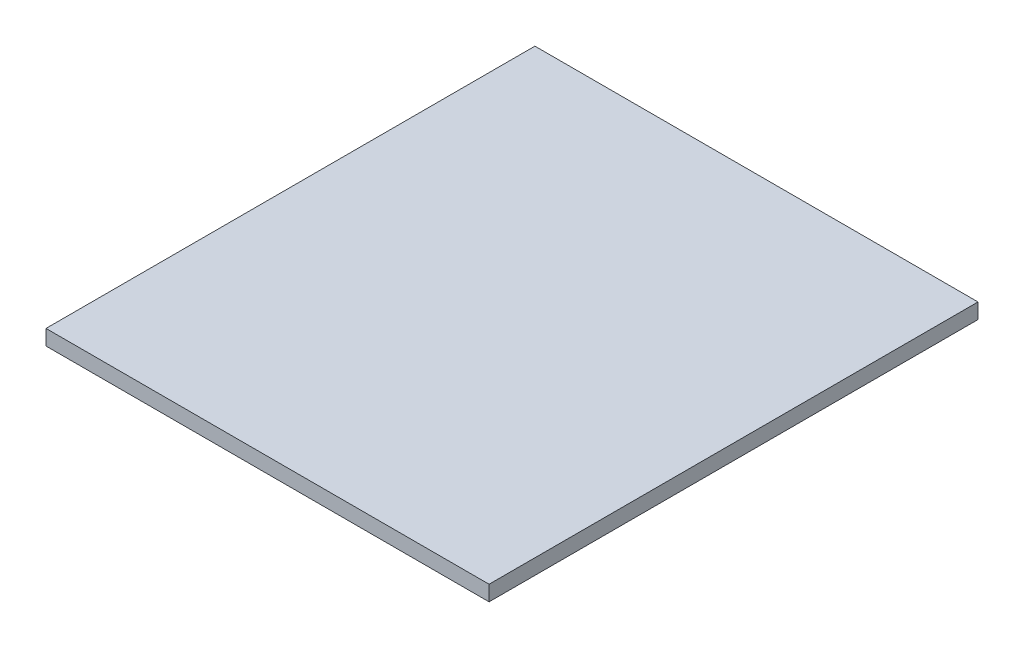
ISO-10303-21;
HEADER;
FILE_DESCRIPTION(('STEP AP214'),'2;1');
FILE_NAME('part.step','',(''),(''),'','','');
FILE_SCHEMA(('AUTOMOTIVE_DESIGN { 1 0 10303 214 1 1 1 1 }'));
ENDSEC;
DATA;
#1=APPLICATION_CONTEXT('core data for automotive mechanical design processes');
#2=APPLICATION_PROTOCOL_DEFINITION('international standard','automotive_design',2000,#1);
#3=PRODUCT_CONTEXT('',#1,'mechanical');
#4=PRODUCT('Part','Part','',(#3));
#5=PRODUCT_RELATED_PRODUCT_CATEGORY('part','',(#4));
#6=PRODUCT_DEFINITION_FORMATION('','',#4);
#7=PRODUCT_DEFINITION_CONTEXT('part definition',#1,'design');
#8=PRODUCT_DEFINITION('design','',#6,#7);
#9=PRODUCT_DEFINITION_SHAPE('','',#8);
#10=(LENGTH_UNIT() NAMED_UNIT(*) SI_UNIT(.MILLI.,.METRE.));
#11=(NAMED_UNIT(*) PLANE_ANGLE_UNIT() SI_UNIT($,.RADIAN.));
#12=(NAMED_UNIT(*) SI_UNIT($,.STERADIAN.) SOLID_ANGLE_UNIT());
#13=UNCERTAINTY_MEASURE_WITH_UNIT(LENGTH_MEASURE(1.E-05),#10,'distance_accuracy_value','');
#14=(GEOMETRIC_REPRESENTATION_CONTEXT(3) GLOBAL_UNCERTAINTY_ASSIGNED_CONTEXT((#13)) GLOBAL_UNIT_ASSIGNED_CONTEXT((#10,
#11,#12)) REPRESENTATION_CONTEXT('',''));
#15=CARTESIAN_POINT('',(0.,0.,0.));
#16=DIRECTION('',(0.,0.,1.));
#17=DIRECTION('',(1.,0.,0.));
#18=AXIS2_PLACEMENT_3D('',#15,#16,#17);
#19=CARTESIAN_POINT('',(0.,10.,0.));
#20=DIRECTION('',(1.,0.,0.));
#21=DIRECTION('',(0.,0.,-1.));
#22=AXIS2_PLACEMENT_3D('',#19,#20,#21);
#23=PLANE('',#22);
#24=DIRECTION('',(0.,0.,1.));
#25=VECTOR('',#24,1.);
#26=CARTESIAN_POINT('',(0.,0.,0.));
#27=LINE('',#26,#25);
#28=CARTESIAN_POINT('',(0.,0.,-320.));
#29=VERTEX_POINT('',#28);
#30=CARTESIAN_POINT('',(0.,0.,0.));
#31=VERTEX_POINT('',#30);
#32=EDGE_CURVE('E98',#29,#31,#27,.T.);
#33=ORIENTED_EDGE('',*,*,#32,.T.);
#34=DIRECTION('',(0.,-1.,0.));
#35=VECTOR('',#34,1.);
#36=CARTESIAN_POINT('',(0.,10.,0.));
#37=LINE('',#36,#35);
#38=CARTESIAN_POINT('',(0.,10.,0.));
#39=VERTEX_POINT('',#38);
#40=EDGE_CURVE('E11',#39,#31,#37,.T.);
#41=ORIENTED_EDGE('',*,*,#40,.F.);
#42=DIRECTION('',(0.,0.,1.));
#43=VECTOR('',#42,1.);
#44=CARTESIAN_POINT('',(0.,10.,0.));
#45=LINE('',#44,#43);
#46=CARTESIAN_POINT('',(0.,10.,-320.));
#47=VERTEX_POINT('',#46);
#48=EDGE_CURVE('E86',#47,#39,#45,.T.);
#49=ORIENTED_EDGE('',*,*,#48,.F.);
#50=DIRECTION('',(0.,-1.,0.));
#51=VECTOR('',#50,1.);
#52=CARTESIAN_POINT('',(0.,10.,-320.));
#53=LINE('',#52,#51);
#54=EDGE_CURVE('E94',#47,#29,#53,.T.);
#55=ORIENTED_EDGE('',*,*,#54,.T.);
#56=EDGE_LOOP('',(#33,#41,#49,#55));
#57=FACE_BOUND('',#56,.T.);
#58=ADVANCED_FACE('F35',(#57),#23,.F.);
#59=CARTESIAN_POINT('',(0.,10.,0.));
#60=DIRECTION('',(0.,0.,-1.));
#61=DIRECTION('',(-1.,0.,0.));
#62=AXIS2_PLACEMENT_3D('',#59,#60,#61);
#63=PLANE('',#62);
#64=DIRECTION('',(1.,0.,0.));
#65=VECTOR('',#64,1.);
#66=CARTESIAN_POINT('',(0.,0.,0.));
#67=LINE('',#66,#65);
#68=CARTESIAN_POINT('',(290.,0.,0.));
#69=VERTEX_POINT('',#68);
#70=EDGE_CURVE('E90',#31,#69,#67,.T.);
#71=ORIENTED_EDGE('',*,*,#70,.T.);
#72=DIRECTION('',(0.,-1.,0.));
#73=VECTOR('',#72,1.);
#74=CARTESIAN_POINT('',(290.,10.,0.));
#75=LINE('',#74,#73);
#76=CARTESIAN_POINT('',(290.,10.,0.));
#77=VERTEX_POINT('',#76);
#78=EDGE_CURVE('E43',#77,#69,#75,.T.);
#79=ORIENTED_EDGE('',*,*,#78,.F.);
#80=DIRECTION('',(1.,0.,0.));
#81=VECTOR('',#80,1.);
#82=CARTESIAN_POINT('',(0.,10.,0.));
#83=LINE('',#82,#81);
#84=EDGE_CURVE('E81',#39,#77,#83,.T.);
#85=ORIENTED_EDGE('',*,*,#84,.F.);
#86=ORIENTED_EDGE('',*,*,#40,.T.);
#87=EDGE_LOOP('',(#71,#79,#85,#86));
#88=FACE_BOUND('',#87,.T.);
#89=ADVANCED_FACE('F89',(#88),#63,.F.);
#90=CARTESIAN_POINT('',(290.,10.,0.));
#91=DIRECTION('',(-1.,0.,0.));
#92=DIRECTION('',(0.,0.,1.));
#93=AXIS2_PLACEMENT_3D('',#90,#91,#92);
#94=PLANE('',#93);
#95=DIRECTION('',(0.,0.,-1.));
#96=VECTOR('',#95,1.);
#97=CARTESIAN_POINT('',(290.,0.,0.));
#98=LINE('',#97,#96);
#99=CARTESIAN_POINT('',(290.,0.,-320.));
#100=VERTEX_POINT('',#99);
#101=EDGE_CURVE('E68',#69,#100,#98,.T.);
#102=ORIENTED_EDGE('',*,*,#101,.T.);
#103=DIRECTION('',(0.,-1.,0.));
#104=VECTOR('',#103,1.);
#105=CARTESIAN_POINT('',(290.,10.,-320.));
#106=LINE('',#105,#104);
#107=CARTESIAN_POINT('',(290.,10.,-320.));
#108=VERTEX_POINT('',#107);
#109=EDGE_CURVE('E91',#108,#100,#106,.T.);
#110=ORIENTED_EDGE('',*,*,#109,.F.);
#111=DIRECTION('',(0.,0.,-1.));
#112=VECTOR('',#111,1.);
#113=CARTESIAN_POINT('',(290.,10.,0.));
#114=LINE('',#113,#112);
#115=EDGE_CURVE('E84',#77,#108,#114,.T.);
#116=ORIENTED_EDGE('',*,*,#115,.F.);
#117=ORIENTED_EDGE('',*,*,#78,.T.);
#118=EDGE_LOOP('',(#102,#110,#116,#117));
#119=FACE_BOUND('',#118,.T.);
#120=ADVANCED_FACE('F92',(#119),#94,.F.);
#121=CARTESIAN_POINT('',(0.,10.,-320.));
#122=DIRECTION('',(0.,0.,1.));
#123=DIRECTION('',(1.,0.,0.));
#124=AXIS2_PLACEMENT_3D('',#121,#122,#123);
#125=PLANE('',#124);
#126=DIRECTION('',(-1.,0.,0.));
#127=VECTOR('',#126,1.);
#128=CARTESIAN_POINT('',(0.,0.,-320.));
#129=LINE('',#128,#127);
#130=EDGE_CURVE('E74',#100,#29,#129,.T.);
#131=ORIENTED_EDGE('',*,*,#130,.T.);
#132=ORIENTED_EDGE('',*,*,#54,.F.);
#133=DIRECTION('',(-1.,0.,0.));
#134=VECTOR('',#133,1.);
#135=CARTESIAN_POINT('',(0.,10.,-320.));
#136=LINE('',#135,#134);
#137=EDGE_CURVE('E51',#108,#47,#136,.T.);
#138=ORIENTED_EDGE('',*,*,#137,.F.);
#139=ORIENTED_EDGE('',*,*,#109,.T.);
#140=EDGE_LOOP('',(#131,#132,#138,#139));
#141=FACE_BOUND('',#140,.T.);
#142=ADVANCED_FACE('F105',(#141),#125,.F.);
#143=CARTESIAN_POINT('',(0.,10.,0.));
#144=DIRECTION('',(0.,-1.,0.));
#145=DIRECTION('',(0.,0.,-1.));
#146=AXIS2_PLACEMENT_3D('',#143,#144,#145);
#147=PLANE('',#146);
#148=ORIENTED_EDGE('',*,*,#48,.T.);
#149=ORIENTED_EDGE('',*,*,#84,.T.);
#150=ORIENTED_EDGE('',*,*,#115,.T.);
#151=ORIENTED_EDGE('',*,*,#137,.T.);
#152=EDGE_LOOP('',(#148,#149,#150,#151));
#153=FACE_BOUND('',#152,.T.);
#154=ADVANCED_FACE('F82',(#153),#147,.F.);
#155=CARTESIAN_POINT('',(0.,0.,0.));
#156=DIRECTION('',(0.,-1.,0.));
#157=DIRECTION('',(0.,0.,-1.));
#158=AXIS2_PLACEMENT_3D('',#155,#156,#157);
#159=PLANE('',#158);
#160=ORIENTED_EDGE('',*,*,#32,.F.);
#161=ORIENTED_EDGE('',*,*,#130,.F.);
#162=ORIENTED_EDGE('',*,*,#101,.F.);
#163=ORIENTED_EDGE('',*,*,#70,.F.);
#164=EDGE_LOOP('',(#160,#161,#162,#163));
#165=FACE_BOUND('',#164,.T.);
#166=ADVANCED_FACE('F108',(#165),#159,.T.);
#167=CLOSED_SHELL('',(#58,#89,#120,#142,#154,#166));
#168=MANIFOLD_SOLID_BREP('B2',#167);
#169=ADVANCED_BREP_SHAPE_REPRESENTATION('',(#18,#168),#14);
#170=SHAPE_DEFINITION_REPRESENTATION(#9,#169);
ENDSEC;
END-ISO-10303-21;
